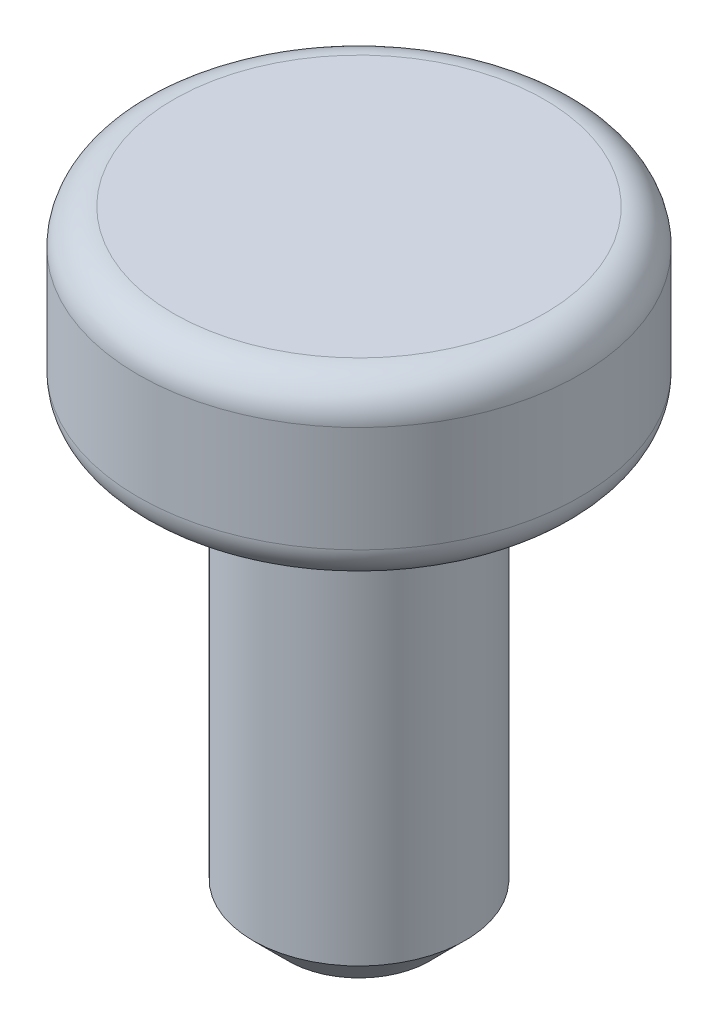
ISO-10303-21;
HEADER;
FILE_DESCRIPTION(('STEP AP214'),'2;1');
FILE_NAME('part.step','',(''),(''),'','','');
FILE_SCHEMA(('AUTOMOTIVE_DESIGN { 1 0 10303 214 1 1 1 1 }'));
ENDSEC;
DATA;
#1=APPLICATION_CONTEXT('core data for automotive mechanical design processes');
#2=APPLICATION_PROTOCOL_DEFINITION('international standard','automotive_design',2000,#1);
#3=PRODUCT_CONTEXT('',#1,'mechanical');
#4=PRODUCT('Part','Part','',(#3));
#5=PRODUCT_RELATED_PRODUCT_CATEGORY('part','',(#4));
#6=PRODUCT_DEFINITION_FORMATION('','',#4);
#7=PRODUCT_DEFINITION_CONTEXT('part definition',#1,'design');
#8=PRODUCT_DEFINITION('design','',#6,#7);
#9=PRODUCT_DEFINITION_SHAPE('','',#8);
#10=(LENGTH_UNIT() NAMED_UNIT(*) SI_UNIT(.MILLI.,.METRE.));
#11=(NAMED_UNIT(*) PLANE_ANGLE_UNIT() SI_UNIT($,.RADIAN.));
#12=(NAMED_UNIT(*) SI_UNIT($,.STERADIAN.) SOLID_ANGLE_UNIT());
#13=UNCERTAINTY_MEASURE_WITH_UNIT(LENGTH_MEASURE(1.E-05),#10,'distance_accuracy_value','');
#14=(GEOMETRIC_REPRESENTATION_CONTEXT(3) GLOBAL_UNCERTAINTY_ASSIGNED_CONTEXT((#13)) GLOBAL_UNIT_ASSIGNED_CONTEXT((#10,
#11,#12)) REPRESENTATION_CONTEXT('',''));
#15=CARTESIAN_POINT('',(0.,0.,0.));
#16=DIRECTION('',(0.,0.,1.));
#17=DIRECTION('',(1.,0.,0.));
#18=AXIS2_PLACEMENT_3D('',#15,#16,#17);
#19=CARTESIAN_POINT('',(0.,0.,0.));
#20=DIRECTION('',(0.,1.,0.));
#21=DIRECTION('',(0.,0.,1.));
#22=AXIS2_PLACEMENT_3D('',#19,#20,#21);
#23=PLANE('',#22);
#24=CARTESIAN_POINT('',(0.,0.,0.));
#25=DIRECTION('',(0.,1.,0.));
#26=DIRECTION('',(0.,0.,1.));
#27=AXIS2_PLACEMENT_3D('',#24,#25,#26);
#28=CIRCLE('',#27,1.05);
#29=CARTESIAN_POINT('',(0.,0.,1.05));
#30=VERTEX_POINT('',#29);
#31=EDGE_CURVE('E34',#30,#30,#28,.F.);
#32=ORIENTED_EDGE('',*,*,#31,.T.);
#33=EDGE_LOOP('',(#32));
#34=FACE_BOUND('',#33,.T.);
#35=CARTESIAN_POINT('',(0.,0.,0.));
#36=DIRECTION('',(0.,1.,0.));
#37=DIRECTION('',(0.,0.,1.));
#38=AXIS2_PLACEMENT_3D('',#35,#36,#37);
#39=CIRCLE('',#38,0.6);
#40=CARTESIAN_POINT('',(0.,0.,0.6));
#41=VERTEX_POINT('',#40);
#42=EDGE_CURVE('E25',#41,#41,#39,.F.);
#43=ORIENTED_EDGE('',*,*,#42,.F.);
#44=EDGE_LOOP('',(#43));
#45=FACE_BOUND('',#44,.T.);
#46=ADVANCED_FACE('F14',(#34,#45),#23,.F.);
#47=CARTESIAN_POINT('',(0.,1.,0.));
#48=DIRECTION('',(0.,-1.,0.));
#49=DIRECTION('',(0.,0.,-1.));
#50=AXIS2_PLACEMENT_3D('',#47,#48,#49);
#51=CYLINDRICAL_SURFACE('',#50,1.25);
#52=CARTESIAN_POINT('',(0.,0.2,0.));
#53=DIRECTION('',(0.,1.,0.));
#54=DIRECTION('',(0.,0.,1.));
#55=AXIS2_PLACEMENT_3D('',#52,#53,#54);
#56=CIRCLE('',#55,1.25);
#57=CARTESIAN_POINT('',(0.,0.2,1.25));
#58=VERTEX_POINT('',#57);
#59=EDGE_CURVE('E37',#58,#58,#56,.T.);
#60=ORIENTED_EDGE('',*,*,#59,.T.);
#61=EDGE_LOOP('',(#60));
#62=FACE_BOUND('',#61,.T.);
#63=CARTESIAN_POINT('',(0.,0.8,0.));
#64=DIRECTION('',(0.,1.,0.));
#65=DIRECTION('',(0.,0.,1.));
#66=AXIS2_PLACEMENT_3D('',#63,#64,#65);
#67=CIRCLE('',#66,1.25);
#68=CARTESIAN_POINT('',(0.,0.8,1.25));
#69=VERTEX_POINT('',#68);
#70=EDGE_CURVE('E40',#69,#69,#67,.F.);
#71=ORIENTED_EDGE('',*,*,#70,.T.);
#72=EDGE_LOOP('',(#71));
#73=FACE_BOUND('',#72,.T.);
#74=ADVANCED_FACE('F44',(#62,#73),#51,.T.);
#75=CARTESIAN_POINT('',(0.,1.,0.));
#76=DIRECTION('',(0.,1.,0.));
#77=DIRECTION('',(0.,0.,1.));
#78=AXIS2_PLACEMENT_3D('',#75,#76,#77);
#79=PLANE('',#78);
#80=CARTESIAN_POINT('',(0.,1.,0.));
#81=DIRECTION('',(0.,1.,0.));
#82=DIRECTION('',(0.,0.,1.));
#83=AXIS2_PLACEMENT_3D('',#80,#81,#82);
#84=CIRCLE('',#83,1.05);
#85=CARTESIAN_POINT('',(0.,1.,1.05));
#86=VERTEX_POINT('',#85);
#87=EDGE_CURVE('E29',#86,#86,#84,.T.);
#88=ORIENTED_EDGE('',*,*,#87,.T.);
#89=EDGE_LOOP('',(#88));
#90=FACE_BOUND('',#89,.T.);
#91=ADVANCED_FACE('F53',(#90),#79,.T.);
#92=CARTESIAN_POINT('',(0.,0.2,0.));
#93=DIRECTION('',(0.,1.,0.));
#94=DIRECTION('',(0.,0.,1.));
#95=AXIS2_PLACEMENT_3D('',#92,#93,#94);
#96=TOROIDAL_SURFACE('',#95,1.05,0.2);
#97=ORIENTED_EDGE('',*,*,#31,.F.);
#98=EDGE_LOOP('',(#97));
#99=FACE_BOUND('',#98,.T.);
#100=ORIENTED_EDGE('',*,*,#59,.F.);
#101=EDGE_LOOP('',(#100));
#102=FACE_BOUND('',#101,.T.);
#103=ADVANCED_FACE('F50',(#99,#102),#96,.T.);
#104=CARTESIAN_POINT('',(0.,0.8,0.));
#105=DIRECTION('',(0.,1.,0.));
#106=DIRECTION('',(0.,0.,1.));
#107=AXIS2_PLACEMENT_3D('',#104,#105,#106);
#108=TOROIDAL_SURFACE('',#107,1.05,0.2);
#109=ORIENTED_EDGE('',*,*,#70,.F.);
#110=EDGE_LOOP('',(#109));
#111=FACE_BOUND('',#110,.T.);
#112=ORIENTED_EDGE('',*,*,#87,.F.);
#113=EDGE_LOOP('',(#112));
#114=FACE_BOUND('',#113,.T.);
#115=ADVANCED_FACE('F46',(#111,#114),#108,.T.);
#116=CARTESIAN_POINT('',(0.,-2.5,0.));
#117=DIRECTION('',(0.,1.,0.));
#118=DIRECTION('',(0.,0.,1.));
#119=AXIS2_PLACEMENT_3D('',#116,#117,#118);
#120=CYLINDRICAL_SURFACE('',#119,0.6);
#121=CARTESIAN_POINT('',(0.,-2.3,0.));
#122=DIRECTION('',(0.,-1.,0.));
#123=DIRECTION('',(0.,0.,-1.));
#124=AXIS2_PLACEMENT_3D('',#121,#122,#123);
#125=CIRCLE('',#124,0.6);
#126=CARTESIAN_POINT('',(0.,-2.3,-0.6));
#127=VERTEX_POINT('',#126);
#128=EDGE_CURVE('E10',#127,#127,#125,.F.);
#129=ORIENTED_EDGE('',*,*,#128,.T.);
#130=EDGE_LOOP('',(#129));
#131=FACE_BOUND('',#130,.T.);
#132=ORIENTED_EDGE('',*,*,#42,.T.);
#133=EDGE_LOOP('',(#132));
#134=FACE_BOUND('',#133,.T.);
#135=ADVANCED_FACE('F49',(#131,#134),#120,.T.);
#136=CARTESIAN_POINT('',(0.,-2.5,0.));
#137=DIRECTION('',(0.,-1.,0.));
#138=DIRECTION('',(0.,0.,-1.));
#139=AXIS2_PLACEMENT_3D('',#136,#137,#138);
#140=PLANE('',#139);
#141=CARTESIAN_POINT('',(0.,-2.5,0.));
#142=DIRECTION('',(0.,-1.,0.));
#143=DIRECTION('',(0.,0.,-1.));
#144=AXIS2_PLACEMENT_3D('',#141,#142,#143);
#145=CIRCLE('',#144,0.4);
#146=CARTESIAN_POINT('',(0.,-2.5,-0.4));
#147=VERTEX_POINT('',#146);
#148=EDGE_CURVE('E21',#147,#147,#145,.T.);
#149=ORIENTED_EDGE('',*,*,#148,.T.);
#150=EDGE_LOOP('',(#149));
#151=FACE_BOUND('',#150,.T.);
#152=ADVANCED_FACE('F78',(#151),#140,.T.);
#153=CARTESIAN_POINT('',(0.,-2.5,0.));
#154=DIRECTION('',(0.,1.,0.));
#155=DIRECTION('',(0.,0.,1.));
#156=AXIS2_PLACEMENT_3D('',#153,#154,#155);
#157=CONICAL_SURFACE('',#156,0.4,0.785398163397446);
#158=ORIENTED_EDGE('',*,*,#128,.F.);
#159=EDGE_LOOP('',(#158));
#160=FACE_BOUND('',#159,.T.);
#161=ORIENTED_EDGE('',*,*,#148,.F.);
#162=EDGE_LOOP('',(#161));
#163=FACE_BOUND('',#162,.T.);
#164=ADVANCED_FACE('F16',(#160,#163),#157,.T.);
#165=CLOSED_SHELL('',(#46,#74,#91,#103,#115,#135,#152,#164));
#166=MANIFOLD_SOLID_BREP('B1',#165);
#167=ADVANCED_BREP_SHAPE_REPRESENTATION('',(#18,#166),#14);
#168=SHAPE_DEFINITION_REPRESENTATION(#9,#167);
ENDSEC;
END-ISO-10303-21;
